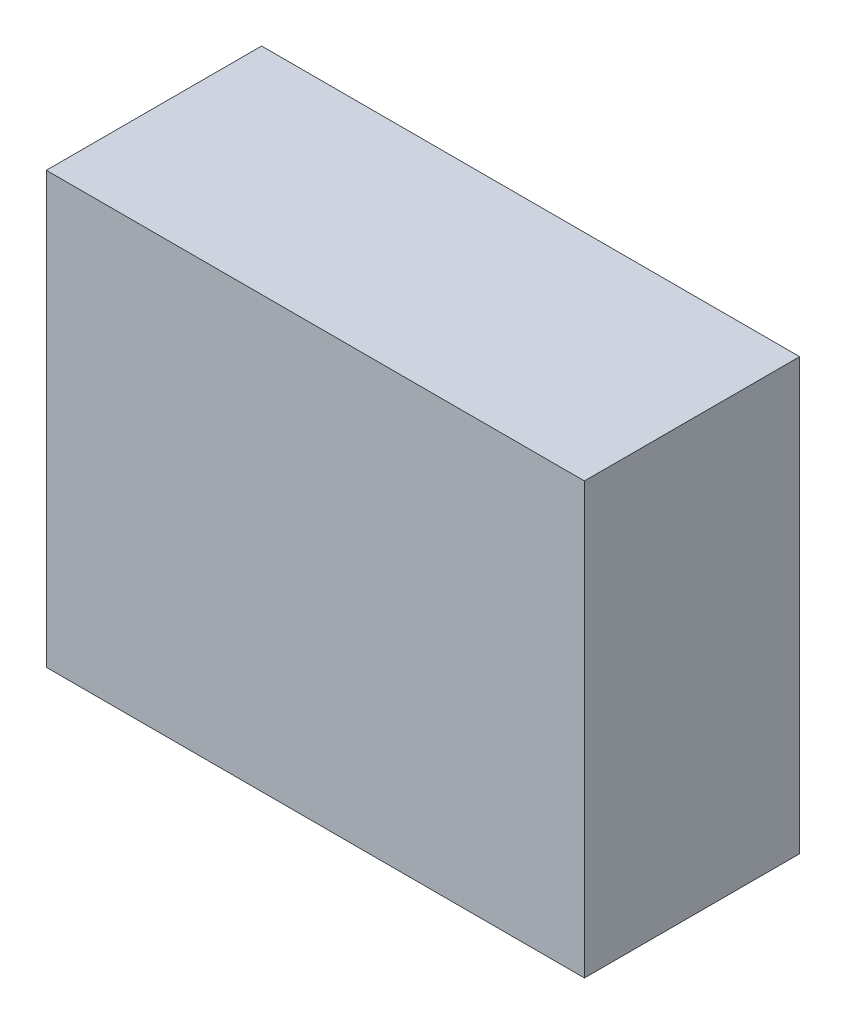
ISO-10303-21;
HEADER;
FILE_DESCRIPTION(('STEP AP214'),'2;1');
FILE_NAME('part.step','',(''),(''),'','','');
FILE_SCHEMA(('AUTOMOTIVE_DESIGN { 1 0 10303 214 1 1 1 1 }'));
ENDSEC;
DATA;
#1=APPLICATION_CONTEXT('core data for automotive mechanical design processes');
#2=APPLICATION_PROTOCOL_DEFINITION('international standard','automotive_design',2000,#1);
#3=PRODUCT_CONTEXT('',#1,'mechanical');
#4=PRODUCT('Part','Part','',(#3));
#5=PRODUCT_RELATED_PRODUCT_CATEGORY('part','',(#4));
#6=PRODUCT_DEFINITION_FORMATION('','',#4);
#7=PRODUCT_DEFINITION_CONTEXT('part definition',#1,'design');
#8=PRODUCT_DEFINITION('design','',#6,#7);
#9=PRODUCT_DEFINITION_SHAPE('','',#8);
#10=(LENGTH_UNIT() NAMED_UNIT(*) SI_UNIT(.MILLI.,.METRE.));
#11=(NAMED_UNIT(*) PLANE_ANGLE_UNIT() SI_UNIT($,.RADIAN.));
#12=(NAMED_UNIT(*) SI_UNIT($,.STERADIAN.) SOLID_ANGLE_UNIT());
#13=UNCERTAINTY_MEASURE_WITH_UNIT(LENGTH_MEASURE(1.E-05),#10,'distance_accuracy_value','');
#14=(GEOMETRIC_REPRESENTATION_CONTEXT(3) GLOBAL_UNCERTAINTY_ASSIGNED_CONTEXT((#13)) GLOBAL_UNIT_ASSIGNED_CONTEXT((#10,
#11,#12)) REPRESENTATION_CONTEXT('',''));
#15=CARTESIAN_POINT('',(0.,0.,0.));
#16=DIRECTION('',(0.,0.,1.));
#17=DIRECTION('',(1.,0.,0.));
#18=AXIS2_PLACEMENT_3D('',#15,#16,#17);
#19=CARTESIAN_POINT('',(25.,40.,10.));
#20=DIRECTION('',(-1.,0.,0.));
#21=DIRECTION('',(0.,0.,1.));
#22=AXIS2_PLACEMENT_3D('',#19,#20,#21);
#23=PLANE('',#22);
#24=DIRECTION('',(0.,0.,-1.));
#25=VECTOR('',#24,1.);
#26=CARTESIAN_POINT('',(25.,0.,10.));
#27=LINE('',#26,#25);
#28=CARTESIAN_POINT('',(25.,0.,10.));
#29=VERTEX_POINT('',#28);
#30=CARTESIAN_POINT('',(25.,0.,-10.));
#31=VERTEX_POINT('',#30);
#32=EDGE_CURVE('E96',#29,#31,#27,.T.);
#33=ORIENTED_EDGE('',*,*,#32,.T.);
#34=DIRECTION('',(0.,-1.,0.));
#35=VECTOR('',#34,1.);
#36=CARTESIAN_POINT('',(25.,40.,-10.));
#37=LINE('',#36,#35);
#38=CARTESIAN_POINT('',(25.,40.,-10.));
#39=VERTEX_POINT('',#38);
#40=EDGE_CURVE('E11',#39,#31,#37,.T.);
#41=ORIENTED_EDGE('',*,*,#40,.F.);
#42=DIRECTION('',(0.,0.,-1.));
#43=VECTOR('',#42,1.);
#44=CARTESIAN_POINT('',(25.,40.,10.));
#45=LINE('',#44,#43);
#46=CARTESIAN_POINT('',(25.,40.,10.));
#47=VERTEX_POINT('',#46);
#48=EDGE_CURVE('E84',#47,#39,#45,.T.);
#49=ORIENTED_EDGE('',*,*,#48,.F.);
#50=DIRECTION('',(0.,-1.,0.));
#51=VECTOR('',#50,1.);
#52=CARTESIAN_POINT('',(25.,40.,10.));
#53=LINE('',#52,#51);
#54=EDGE_CURVE('E92',#47,#29,#53,.T.);
#55=ORIENTED_EDGE('',*,*,#54,.T.);
#56=EDGE_LOOP('',(#33,#41,#49,#55));
#57=FACE_BOUND('',#56,.T.);
#58=ADVANCED_FACE('F33',(#57),#23,.F.);
#59=CARTESIAN_POINT('',(-25.,40.,-10.));
#60=DIRECTION('',(0.,0.,1.));
#61=DIRECTION('',(1.,0.,0.));
#62=AXIS2_PLACEMENT_3D('',#59,#60,#61);
#63=PLANE('',#62);
#64=DIRECTION('',(-1.,0.,0.));
#65=VECTOR('',#64,1.);
#66=CARTESIAN_POINT('',(-25.,0.,-10.));
#67=LINE('',#66,#65);
#68=CARTESIAN_POINT('',(-25.,0.,-10.));
#69=VERTEX_POINT('',#68);
#70=EDGE_CURVE('E88',#31,#69,#67,.T.);
#71=ORIENTED_EDGE('',*,*,#70,.T.);
#72=DIRECTION('',(0.,-1.,0.));
#73=VECTOR('',#72,1.);
#74=CARTESIAN_POINT('',(-25.,40.,-10.));
#75=LINE('',#74,#73);
#76=CARTESIAN_POINT('',(-25.,40.,-10.));
#77=VERTEX_POINT('',#76);
#78=EDGE_CURVE('E41',#77,#69,#75,.T.);
#79=ORIENTED_EDGE('',*,*,#78,.F.);
#80=DIRECTION('',(-1.,0.,0.));
#81=VECTOR('',#80,1.);
#82=CARTESIAN_POINT('',(-25.,40.,-10.));
#83=LINE('',#82,#81);
#84=EDGE_CURVE('E79',#39,#77,#83,.T.);
#85=ORIENTED_EDGE('',*,*,#84,.F.);
#86=ORIENTED_EDGE('',*,*,#40,.T.);
#87=EDGE_LOOP('',(#71,#79,#85,#86));
#88=FACE_BOUND('',#87,.T.);
#89=ADVANCED_FACE('F87',(#88),#63,.F.);
#90=CARTESIAN_POINT('',(-25.,40.,10.));
#91=DIRECTION('',(1.,0.,0.));
#92=DIRECTION('',(0.,0.,-1.));
#93=AXIS2_PLACEMENT_3D('',#90,#91,#92);
#94=PLANE('',#93);
#95=DIRECTION('',(0.,0.,1.));
#96=VECTOR('',#95,1.);
#97=CARTESIAN_POINT('',(-25.,0.,10.));
#98=LINE('',#97,#96);
#99=CARTESIAN_POINT('',(-25.,0.,10.));
#100=VERTEX_POINT('',#99);
#101=EDGE_CURVE('E66',#69,#100,#98,.T.);
#102=ORIENTED_EDGE('',*,*,#101,.T.);
#103=DIRECTION('',(0.,-1.,0.));
#104=VECTOR('',#103,1.);
#105=CARTESIAN_POINT('',(-25.,40.,10.));
#106=LINE('',#105,#104);
#107=CARTESIAN_POINT('',(-25.,40.,10.));
#108=VERTEX_POINT('',#107);
#109=EDGE_CURVE('E89',#108,#100,#106,.T.);
#110=ORIENTED_EDGE('',*,*,#109,.F.);
#111=DIRECTION('',(0.,0.,1.));
#112=VECTOR('',#111,1.);
#113=CARTESIAN_POINT('',(-25.,40.,10.));
#114=LINE('',#113,#112);
#115=EDGE_CURVE('E82',#77,#108,#114,.T.);
#116=ORIENTED_EDGE('',*,*,#115,.F.);
#117=ORIENTED_EDGE('',*,*,#78,.T.);
#118=EDGE_LOOP('',(#102,#110,#116,#117));
#119=FACE_BOUND('',#118,.T.);
#120=ADVANCED_FACE('F90',(#119),#94,.F.);
#121=CARTESIAN_POINT('',(-25.,40.,10.));
#122=DIRECTION('',(0.,0.,-1.));
#123=DIRECTION('',(-1.,0.,0.));
#124=AXIS2_PLACEMENT_3D('',#121,#122,#123);
#125=PLANE('',#124);
#126=DIRECTION('',(1.,0.,0.));
#127=VECTOR('',#126,1.);
#128=CARTESIAN_POINT('',(-25.,0.,10.));
#129=LINE('',#128,#127);
#130=EDGE_CURVE('E72',#100,#29,#129,.T.);
#131=ORIENTED_EDGE('',*,*,#130,.T.);
#132=ORIENTED_EDGE('',*,*,#54,.F.);
#133=DIRECTION('',(1.,0.,0.));
#134=VECTOR('',#133,1.);
#135=CARTESIAN_POINT('',(-25.,40.,10.));
#136=LINE('',#135,#134);
#137=EDGE_CURVE('E49',#108,#47,#136,.T.);
#138=ORIENTED_EDGE('',*,*,#137,.F.);
#139=ORIENTED_EDGE('',*,*,#109,.T.);
#140=EDGE_LOOP('',(#131,#132,#138,#139));
#141=FACE_BOUND('',#140,.T.);
#142=ADVANCED_FACE('F103',(#141),#125,.F.);
#143=CARTESIAN_POINT('',(0.,40.,0.));
#144=DIRECTION('',(0.,-1.,0.));
#145=DIRECTION('',(0.,0.,-1.));
#146=AXIS2_PLACEMENT_3D('',#143,#144,#145);
#147=PLANE('',#146);
#148=ORIENTED_EDGE('',*,*,#48,.T.);
#149=ORIENTED_EDGE('',*,*,#84,.T.);
#150=ORIENTED_EDGE('',*,*,#115,.T.);
#151=ORIENTED_EDGE('',*,*,#137,.T.);
#152=EDGE_LOOP('',(#148,#149,#150,#151));
#153=FACE_BOUND('',#152,.T.);
#154=ADVANCED_FACE('F80',(#153),#147,.F.);
#155=CARTESIAN_POINT('',(0.,0.,0.));
#156=DIRECTION('',(0.,-1.,0.));
#157=DIRECTION('',(0.,0.,-1.));
#158=AXIS2_PLACEMENT_3D('',#155,#156,#157);
#159=PLANE('',#158);
#160=ORIENTED_EDGE('',*,*,#32,.F.);
#161=ORIENTED_EDGE('',*,*,#130,.F.);
#162=ORIENTED_EDGE('',*,*,#101,.F.);
#163=ORIENTED_EDGE('',*,*,#70,.F.);
#164=EDGE_LOOP('',(#160,#161,#162,#163));
#165=FACE_BOUND('',#164,.T.);
#166=ADVANCED_FACE('F106',(#165),#159,.T.);
#167=CLOSED_SHELL('',(#58,#89,#120,#142,#154,#166));
#168=MANIFOLD_SOLID_BREP('B2',#167);
#169=ADVANCED_BREP_SHAPE_REPRESENTATION('',(#18,#168),#14);
#170=SHAPE_DEFINITION_REPRESENTATION(#9,#169);
ENDSEC;
END-ISO-10303-21;
